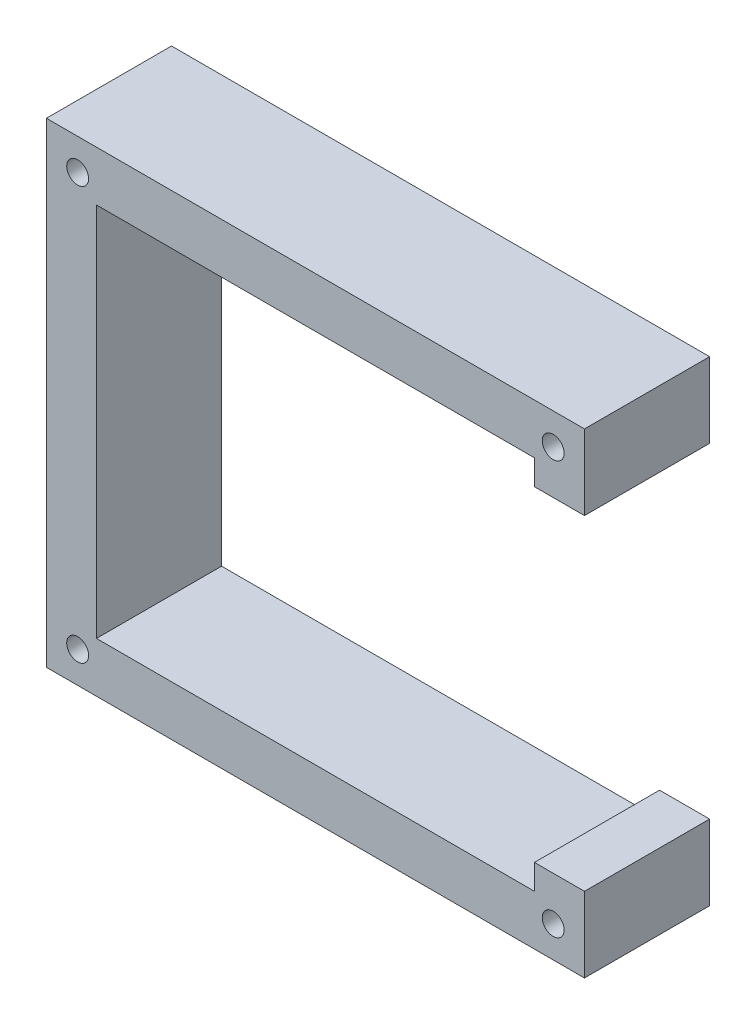
ISO-10303-21;
HEADER;
FILE_DESCRIPTION(('STEP AP214'),'2;1');
FILE_NAME('part.step','',(''),(''),'','','');
FILE_SCHEMA(('AUTOMOTIVE_DESIGN { 1 0 10303 214 1 1 1 1 }'));
ENDSEC;
DATA;
#1=APPLICATION_CONTEXT('core data for automotive mechanical design processes');
#2=APPLICATION_PROTOCOL_DEFINITION('international standard','automotive_design',2000,#1);
#3=PRODUCT_CONTEXT('',#1,'mechanical');
#4=PRODUCT('Part','Part','',(#3));
#5=PRODUCT_RELATED_PRODUCT_CATEGORY('part','',(#4));
#6=PRODUCT_DEFINITION_FORMATION('','',#4);
#7=PRODUCT_DEFINITION_CONTEXT('part definition',#1,'design');
#8=PRODUCT_DEFINITION('design','',#6,#7);
#9=PRODUCT_DEFINITION_SHAPE('','',#8);
#10=(LENGTH_UNIT() NAMED_UNIT(*) SI_UNIT(.MILLI.,.METRE.));
#11=(NAMED_UNIT(*) PLANE_ANGLE_UNIT() SI_UNIT($,.RADIAN.));
#12=(NAMED_UNIT(*) SI_UNIT($,.STERADIAN.) SOLID_ANGLE_UNIT());
#13=UNCERTAINTY_MEASURE_WITH_UNIT(LENGTH_MEASURE(1.E-05),#10,'distance_accuracy_value','');
#14=(GEOMETRIC_REPRESENTATION_CONTEXT(3) GLOBAL_UNCERTAINTY_ASSIGNED_CONTEXT((#13)) GLOBAL_UNIT_ASSIGNED_CONTEXT((#10,
#11,#12)) REPRESENTATION_CONTEXT('',''));
#15=CARTESIAN_POINT('',(0.,0.,0.));
#16=DIRECTION('',(0.,0.,1.));
#17=DIRECTION('',(1.,0.,0.));
#18=AXIS2_PLACEMENT_3D('',#15,#16,#17);
#19=CARTESIAN_POINT('',(35.,0.,20.));
#20=DIRECTION('',(1.,0.,0.));
#21=DIRECTION('',(0.,1.,0.));
#22=AXIS2_PLACEMENT_3D('',#19,#20,#21);
#23=PLANE('',#22);
#24=DIRECTION('',(0.,0.,-1.));
#25=VECTOR('',#24,1.);
#26=CARTESIAN_POINT('',(35.,-26.,20.001));
#27=LINE('',#26,#25);
#28=CARTESIAN_POINT('',(35.,-26.,20.));
#29=VERTEX_POINT('',#28);
#30=CARTESIAN_POINT('',(35.,-26.,0.));
#31=VERTEX_POINT('',#30);
#32=EDGE_CURVE('E138',#29,#31,#27,.T.);
#33=ORIENTED_EDGE('',*,*,#32,.T.);
#34=DIRECTION('',(0.,-1.,0.));
#35=VECTOR('',#34,1.);
#36=CARTESIAN_POINT('',(35.,0.,0.));
#37=LINE('',#36,#35);
#38=CARTESIAN_POINT('',(35.,-30.,0.));
#39=VERTEX_POINT('',#38);
#40=EDGE_CURVE('E193',#31,#39,#37,.T.);
#41=ORIENTED_EDGE('',*,*,#40,.T.);
#42=DIRECTION('',(0.,0.,-1.));
#43=VECTOR('',#42,1.);
#44=CARTESIAN_POINT('',(35.,-30.,20.));
#45=LINE('',#44,#43);
#46=CARTESIAN_POINT('',(35.,-30.,20.));
#47=VERTEX_POINT('',#46);
#48=EDGE_CURVE('E49',#47,#39,#45,.T.);
#49=ORIENTED_EDGE('',*,*,#48,.F.);
#50=DIRECTION('',(0.,-1.,0.));
#51=VECTOR('',#50,1.);
#52=CARTESIAN_POINT('',(35.,0.,20.));
#53=LINE('',#52,#51);
#54=EDGE_CURVE('E155',#29,#47,#53,.T.);
#55=ORIENTED_EDGE('',*,*,#54,.F.);
#56=EDGE_LOOP('',(#33,#41,#49,#55));
#57=FACE_BOUND('',#56,.T.);
#58=ADVANCED_FACE('F40',(#57),#23,.F.);
#59=DIRECTION('',(0.,0.,-1.));
#60=VECTOR('',#59,1.);
#61=CARTESIAN_POINT('',(35.,26.,20.001));
#62=LINE('',#61,#60);
#63=CARTESIAN_POINT('',(35.,26.,20.));
#64=VERTEX_POINT('',#63);
#65=CARTESIAN_POINT('',(35.,26.,0.));
#66=VERTEX_POINT('',#65);
#67=EDGE_CURVE('E57',#64,#66,#62,.T.);
#68=ORIENTED_EDGE('',*,*,#67,.F.);
#69=CARTESIAN_POINT('',(35.,30.,20.));
#70=VERTEX_POINT('',#69);
#71=EDGE_CURVE('E143',#70,#64,#53,.T.);
#72=ORIENTED_EDGE('',*,*,#71,.F.);
#73=DIRECTION('',(0.,0.,-1.));
#74=VECTOR('',#73,1.);
#75=CARTESIAN_POINT('',(35.,30.,20.));
#76=LINE('',#75,#74);
#77=CARTESIAN_POINT('',(35.,30.,0.));
#78=VERTEX_POINT('',#77);
#79=EDGE_CURVE('E11',#70,#78,#76,.T.);
#80=ORIENTED_EDGE('',*,*,#79,.T.);
#81=EDGE_CURVE('E145',#78,#66,#37,.T.);
#82=ORIENTED_EDGE('',*,*,#81,.T.);
#83=EDGE_LOOP('',(#68,#72,#80,#82));
#84=FACE_BOUND('',#83,.T.);
#85=ADVANCED_FACE('F142',(#84),#23,.F.);
#86=CARTESIAN_POINT('',(43.,0.,20.));
#87=DIRECTION('',(1.,0.,0.));
#88=DIRECTION('',(0.,1.,0.));
#89=AXIS2_PLACEMENT_3D('',#86,#87,#88);
#90=PLANE('',#89);
#91=DIRECTION('',(0.,-1.,0.));
#92=VECTOR('',#91,1.);
#93=CARTESIAN_POINT('',(43.,0.,0.));
#94=LINE('',#93,#92);
#95=CARTESIAN_POINT('',(43.,-26.,0.));
#96=VERTEX_POINT('',#95);
#97=CARTESIAN_POINT('',(43.,-38.,0.));
#98=VERTEX_POINT('',#97);
#99=EDGE_CURVE('E186',#96,#98,#94,.T.);
#100=ORIENTED_EDGE('',*,*,#99,.F.);
#101=DIRECTION('',(0.,0.,-1.));
#102=VECTOR('',#101,1.);
#103=CARTESIAN_POINT('',(43.,-26.,20.001));
#104=LINE('',#103,#102);
#105=CARTESIAN_POINT('',(43.,-26.,20.));
#106=VERTEX_POINT('',#105);
#107=EDGE_CURVE('E65',#106,#96,#104,.T.);
#108=ORIENTED_EDGE('',*,*,#107,.F.);
#109=DIRECTION('',(0.,-1.,0.));
#110=VECTOR('',#109,1.);
#111=CARTESIAN_POINT('',(43.,0.,20.));
#112=LINE('',#111,#110);
#113=CARTESIAN_POINT('',(43.,-38.,20.));
#114=VERTEX_POINT('',#113);
#115=EDGE_CURVE('E259',#106,#114,#112,.T.);
#116=ORIENTED_EDGE('',*,*,#115,.T.);
#117=DIRECTION('',(0.,0.,-1.));
#118=VECTOR('',#117,1.);
#119=CARTESIAN_POINT('',(43.,-38.,20.));
#120=LINE('',#119,#118);
#121=EDGE_CURVE('E215',#114,#98,#120,.T.);
#122=ORIENTED_EDGE('',*,*,#121,.T.);
#123=EDGE_LOOP('',(#100,#108,#116,#122));
#124=FACE_BOUND('',#123,.T.);
#125=ADVANCED_FACE('F262',(#124),#90,.T.);
#126=CARTESIAN_POINT('',(43.,38.,20.));
#127=VERTEX_POINT('',#126);
#128=CARTESIAN_POINT('',(43.,26.,20.));
#129=VERTEX_POINT('',#128);
#130=EDGE_CURVE('E238',#127,#129,#112,.T.);
#131=ORIENTED_EDGE('',*,*,#130,.T.);
#132=DIRECTION('',(0.,0.,-1.));
#133=VECTOR('',#132,1.);
#134=CARTESIAN_POINT('',(43.,26.,20.001));
#135=LINE('',#134,#133);
#136=CARTESIAN_POINT('',(43.,26.,0.));
#137=VERTEX_POINT('',#136);
#138=EDGE_CURVE('E132',#129,#137,#135,.T.);
#139=ORIENTED_EDGE('',*,*,#138,.T.);
#140=CARTESIAN_POINT('',(43.,38.,0.));
#141=VERTEX_POINT('',#140);
#142=EDGE_CURVE('E187',#141,#137,#94,.T.);
#143=ORIENTED_EDGE('',*,*,#142,.F.);
#144=DIRECTION('',(0.,0.,-1.));
#145=VECTOR('',#144,1.);
#146=CARTESIAN_POINT('',(43.,38.,20.));
#147=LINE('',#146,#145);
#148=EDGE_CURVE('E171',#127,#141,#147,.T.);
#149=ORIENTED_EDGE('',*,*,#148,.F.);
#150=EDGE_LOOP('',(#131,#139,#143,#149));
#151=FACE_BOUND('',#150,.T.);
#152=ADVANCED_FACE('F237',(#151),#90,.T.);
#153=CARTESIAN_POINT('',(0.,0.,20.));
#154=DIRECTION('',(0.,0.,1.));
#155=DIRECTION('',(1.,0.,0.));
#156=AXIS2_PLACEMENT_3D('',#153,#154,#155);
#157=PLANE('',#156);
#158=CARTESIAN_POINT('',(38.,33.,20.));
#159=DIRECTION('',(0.,0.,1.));
#160=DIRECTION('',(1.,0.,0.));
#161=AXIS2_PLACEMENT_3D('',#158,#159,#160);
#162=CIRCLE('',#161,1.75);
#163=CARTESIAN_POINT('',(39.75,33.,20.));
#164=VERTEX_POINT('',#163);
#165=EDGE_CURVE('E207',#164,#164,#162,.F.);
#166=ORIENTED_EDGE('',*,*,#165,.T.);
#167=EDGE_LOOP('',(#166));
#168=FACE_BOUND('',#167,.T.);
#169=CARTESIAN_POINT('',(-38.,33.,20.));
#170=DIRECTION('',(0.,0.,1.));
#171=DIRECTION('',(1.,0.,0.));
#172=AXIS2_PLACEMENT_3D('',#169,#170,#171);
#173=CIRCLE('',#172,1.75);
#174=CARTESIAN_POINT('',(-36.25,33.,20.));
#175=VERTEX_POINT('',#174);
#176=EDGE_CURVE('E252',#175,#175,#173,.T.);
#177=ORIENTED_EDGE('',*,*,#176,.F.);
#178=EDGE_LOOP('',(#177));
#179=FACE_BOUND('',#178,.T.);
#180=CARTESIAN_POINT('',(38.,-33.,20.));
#181=DIRECTION('',(0.,0.,1.));
#182=DIRECTION('',(1.,0.,0.));
#183=AXIS2_PLACEMENT_3D('',#180,#181,#182);
#184=CIRCLE('',#183,1.75);
#185=CARTESIAN_POINT('',(39.75,-33.,20.));
#186=VERTEX_POINT('',#185);
#187=EDGE_CURVE('E165',#186,#186,#184,.T.);
#188=ORIENTED_EDGE('',*,*,#187,.F.);
#189=EDGE_LOOP('',(#188));
#190=FACE_BOUND('',#189,.T.);
#191=CARTESIAN_POINT('',(-38.,-33.,20.));
#192=DIRECTION('',(0.,0.,1.));
#193=DIRECTION('',(1.,0.,0.));
#194=AXIS2_PLACEMENT_3D('',#191,#192,#193);
#195=CIRCLE('',#194,1.75);
#196=CARTESIAN_POINT('',(-36.25,-33.,20.));
#197=VERTEX_POINT('',#196);
#198=EDGE_CURVE('E168',#197,#197,#195,.F.);
#199=ORIENTED_EDGE('',*,*,#198,.T.);
#200=EDGE_LOOP('',(#199));
#201=FACE_BOUND('',#200,.T.);
#202=ORIENTED_EDGE('',*,*,#115,.F.);
#203=DIRECTION('',(1.,0.,0.));
#204=VECTOR('',#203,1.);
#205=CARTESIAN_POINT('',(0.,-26.,20.));
#206=LINE('',#205,#204);
#207=EDGE_CURVE('E241',#29,#106,#206,.T.);
#208=ORIENTED_EDGE('',*,*,#207,.F.);
#209=ORIENTED_EDGE('',*,*,#54,.T.);
#210=DIRECTION('',(1.,0.,0.));
#211=VECTOR('',#210,1.);
#212=CARTESIAN_POINT('',(0.,-30.,20.));
#213=LINE('',#212,#211);
#214=CARTESIAN_POINT('',(-35.,-30.,20.));
#215=VERTEX_POINT('',#214);
#216=EDGE_CURVE('E154',#215,#47,#213,.T.);
#217=ORIENTED_EDGE('',*,*,#216,.F.);
#218=DIRECTION('',(0.,-1.,0.));
#219=VECTOR('',#218,1.);
#220=CARTESIAN_POINT('',(-35.,0.,20.));
#221=LINE('',#220,#219);
#222=CARTESIAN_POINT('',(-35.,30.,20.));
#223=VERTEX_POINT('',#222);
#224=EDGE_CURVE('E158',#223,#215,#221,.T.);
#225=ORIENTED_EDGE('',*,*,#224,.F.);
#226=DIRECTION('',(1.,0.,0.));
#227=VECTOR('',#226,1.);
#228=CARTESIAN_POINT('',(0.,30.,20.));
#229=LINE('',#228,#227);
#230=EDGE_CURVE('E152',#223,#70,#229,.T.);
#231=ORIENTED_EDGE('',*,*,#230,.T.);
#232=ORIENTED_EDGE('',*,*,#71,.T.);
#233=DIRECTION('',(-1.,0.,0.));
#234=VECTOR('',#233,1.);
#235=CARTESIAN_POINT('',(0.,26.,20.));
#236=LINE('',#235,#234);
#237=EDGE_CURVE('E129',#129,#64,#236,.T.);
#238=ORIENTED_EDGE('',*,*,#237,.F.);
#239=ORIENTED_EDGE('',*,*,#130,.F.);
#240=DIRECTION('',(1.,0.,0.));
#241=VECTOR('',#240,1.);
#242=CARTESIAN_POINT('',(0.,38.,20.));
#243=LINE('',#242,#241);
#244=CARTESIAN_POINT('',(-43.,38.,20.));
#245=VERTEX_POINT('',#244);
#246=EDGE_CURVE('E235',#245,#127,#243,.T.);
#247=ORIENTED_EDGE('',*,*,#246,.F.);
#248=DIRECTION('',(0.,-1.,0.));
#249=VECTOR('',#248,1.);
#250=CARTESIAN_POINT('',(-43.,0.,20.));
#251=LINE('',#250,#249);
#252=CARTESIAN_POINT('',(-43.,-38.,20.));
#253=VERTEX_POINT('',#252);
#254=EDGE_CURVE('E226',#245,#253,#251,.T.);
#255=ORIENTED_EDGE('',*,*,#254,.T.);
#256=DIRECTION('',(1.,0.,0.));
#257=VECTOR('',#256,1.);
#258=CARTESIAN_POINT('',(0.,-38.,20.));
#259=LINE('',#258,#257);
#260=EDGE_CURVE('E257',#253,#114,#259,.T.);
#261=ORIENTED_EDGE('',*,*,#260,.T.);
#262=EDGE_LOOP('',(#202,#208,#209,#217,#225,#231,#232,#238,#239,#247,#255,#261));
#263=FACE_BOUND('',#262,.T.);
#264=ADVANCED_FACE('F149',(#168,#179,#190,#201,#263),#157,.T.);
#265=CARTESIAN_POINT('',(0.,0.,0.));
#266=DIRECTION('',(0.,0.,1.));
#267=DIRECTION('',(1.,0.,0.));
#268=AXIS2_PLACEMENT_3D('',#265,#266,#267);
#269=PLANE('',#268);
#270=CARTESIAN_POINT('',(-38.,-33.,0.));
#271=DIRECTION('',(0.,0.,1.));
#272=DIRECTION('',(1.,0.,0.));
#273=AXIS2_PLACEMENT_3D('',#270,#271,#272);
#274=CIRCLE('',#273,1.75);
#275=CARTESIAN_POINT('',(-36.25,-33.,0.));
#276=VERTEX_POINT('',#275);
#277=EDGE_CURVE('E204',#276,#276,#274,.F.);
#278=ORIENTED_EDGE('',*,*,#277,.F.);
#279=EDGE_LOOP('',(#278));
#280=FACE_BOUND('',#279,.T.);
#281=CARTESIAN_POINT('',(38.,-33.,0.));
#282=DIRECTION('',(0.,0.,1.));
#283=DIRECTION('',(1.,0.,0.));
#284=AXIS2_PLACEMENT_3D('',#281,#282,#283);
#285=CIRCLE('',#284,1.75);
#286=CARTESIAN_POINT('',(39.75,-33.,0.));
#287=VERTEX_POINT('',#286);
#288=EDGE_CURVE('E201',#287,#287,#285,.T.);
#289=ORIENTED_EDGE('',*,*,#288,.T.);
#290=EDGE_LOOP('',(#289));
#291=FACE_BOUND('',#290,.T.);
#292=CARTESIAN_POINT('',(-38.,33.,0.));
#293=DIRECTION('',(0.,0.,1.));
#294=DIRECTION('',(1.,0.,0.));
#295=AXIS2_PLACEMENT_3D('',#292,#293,#294);
#296=CIRCLE('',#295,1.75);
#297=CARTESIAN_POINT('',(-36.25,33.,0.));
#298=VERTEX_POINT('',#297);
#299=EDGE_CURVE('E174',#298,#298,#296,.T.);
#300=ORIENTED_EDGE('',*,*,#299,.T.);
#301=EDGE_LOOP('',(#300));
#302=FACE_BOUND('',#301,.T.);
#303=CARTESIAN_POINT('',(38.,33.,0.));
#304=DIRECTION('',(0.,0.,1.));
#305=DIRECTION('',(1.,0.,0.));
#306=AXIS2_PLACEMENT_3D('',#303,#304,#305);
#307=CIRCLE('',#306,1.75);
#308=CARTESIAN_POINT('',(39.75,33.,0.));
#309=VERTEX_POINT('',#308);
#310=EDGE_CURVE('E137',#309,#309,#307,.F.);
#311=ORIENTED_EDGE('',*,*,#310,.F.);
#312=EDGE_LOOP('',(#311));
#313=FACE_BOUND('',#312,.T.);
#314=DIRECTION('',(1.,0.,0.));
#315=VECTOR('',#314,1.);
#316=CARTESIAN_POINT('',(0.,-26.,0.));
#317=LINE('',#316,#315);
#318=EDGE_CURVE('E146',#31,#96,#317,.T.);
#319=ORIENTED_EDGE('',*,*,#318,.T.);
#320=ORIENTED_EDGE('',*,*,#99,.T.);
#321=DIRECTION('',(1.,0.,0.));
#322=VECTOR('',#321,1.);
#323=CARTESIAN_POINT('',(0.,-38.,0.));
#324=LINE('',#323,#322);
#325=CARTESIAN_POINT('',(-43.,-38.,0.));
#326=VERTEX_POINT('',#325);
#327=EDGE_CURVE('E183',#326,#98,#324,.T.);
#328=ORIENTED_EDGE('',*,*,#327,.F.);
#329=DIRECTION('',(0.,-1.,0.));
#330=VECTOR('',#329,1.);
#331=CARTESIAN_POINT('',(-43.,0.,0.));
#332=LINE('',#331,#330);
#333=CARTESIAN_POINT('',(-43.,38.,0.));
#334=VERTEX_POINT('',#333);
#335=EDGE_CURVE('E180',#334,#326,#332,.T.);
#336=ORIENTED_EDGE('',*,*,#335,.F.);
#337=DIRECTION('',(1.,0.,0.));
#338=VECTOR('',#337,1.);
#339=CARTESIAN_POINT('',(0.,38.,0.));
#340=LINE('',#339,#338);
#341=EDGE_CURVE('E177',#334,#141,#340,.T.);
#342=ORIENTED_EDGE('',*,*,#341,.T.);
#343=ORIENTED_EDGE('',*,*,#142,.T.);
#344=DIRECTION('',(-1.,0.,0.));
#345=VECTOR('',#344,1.);
#346=CARTESIAN_POINT('',(0.,26.,0.));
#347=LINE('',#346,#345);
#348=EDGE_CURVE('E239',#137,#66,#347,.T.);
#349=ORIENTED_EDGE('',*,*,#348,.T.);
#350=ORIENTED_EDGE('',*,*,#81,.F.);
#351=DIRECTION('',(1.,0.,0.));
#352=VECTOR('',#351,1.);
#353=CARTESIAN_POINT('',(0.,30.,0.));
#354=LINE('',#353,#352);
#355=CARTESIAN_POINT('',(-35.,30.,0.));
#356=VERTEX_POINT('',#355);
#357=EDGE_CURVE('E190',#356,#78,#354,.T.);
#358=ORIENTED_EDGE('',*,*,#357,.F.);
#359=DIRECTION('',(0.,-1.,0.));
#360=VECTOR('',#359,1.);
#361=CARTESIAN_POINT('',(-35.,0.,0.));
#362=LINE('',#361,#360);
#363=CARTESIAN_POINT('',(-35.,-30.,0.));
#364=VERTEX_POINT('',#363);
#365=EDGE_CURVE('E198',#356,#364,#362,.T.);
#366=ORIENTED_EDGE('',*,*,#365,.T.);
#367=DIRECTION('',(1.,0.,0.));
#368=VECTOR('',#367,1.);
#369=CARTESIAN_POINT('',(0.,-30.,0.));
#370=LINE('',#369,#368);
#371=EDGE_CURVE('E195',#364,#39,#370,.T.);
#372=ORIENTED_EDGE('',*,*,#371,.T.);
#373=ORIENTED_EDGE('',*,*,#40,.F.);
#374=EDGE_LOOP('',(#319,#320,#328,#336,#342,#343,#349,#350,#358,#366,#372,#373));
#375=FACE_BOUND('',#374,.T.);
#376=ADVANCED_FACE('F232',(#280,#291,#302,#313,#375),#269,.F.);
#377=CARTESIAN_POINT('',(0.,30.,20.));
#378=DIRECTION('',(0.,1.,0.));
#379=DIRECTION('',(0.,0.,1.));
#380=AXIS2_PLACEMENT_3D('',#377,#378,#379);
#381=PLANE('',#380);
#382=ORIENTED_EDGE('',*,*,#357,.T.);
#383=ORIENTED_EDGE('',*,*,#79,.F.);
#384=ORIENTED_EDGE('',*,*,#230,.F.);
#385=DIRECTION('',(0.,0.,-1.));
#386=VECTOR('',#385,1.);
#387=CARTESIAN_POINT('',(-35.,30.,20.));
#388=LINE('',#387,#386);
#389=EDGE_CURVE('E208',#223,#356,#388,.T.);
#390=ORIENTED_EDGE('',*,*,#389,.T.);
#391=EDGE_LOOP('',(#382,#383,#384,#390));
#392=FACE_BOUND('',#391,.T.);
#393=ADVANCED_FACE('F288',(#392),#381,.F.);
#394=CARTESIAN_POINT('',(0.,-30.,20.));
#395=DIRECTION('',(0.,1.,0.));
#396=DIRECTION('',(0.,0.,1.));
#397=AXIS2_PLACEMENT_3D('',#394,#395,#396);
#398=PLANE('',#397);
#399=ORIENTED_EDGE('',*,*,#371,.F.);
#400=DIRECTION('',(0.,0.,-1.));
#401=VECTOR('',#400,1.);
#402=CARTESIAN_POINT('',(-35.,-30.,20.));
#403=LINE('',#402,#401);
#404=EDGE_CURVE('E210',#215,#364,#403,.T.);
#405=ORIENTED_EDGE('',*,*,#404,.F.);
#406=ORIENTED_EDGE('',*,*,#216,.T.);
#407=ORIENTED_EDGE('',*,*,#48,.T.);
#408=EDGE_LOOP('',(#399,#405,#406,#407));
#409=FACE_BOUND('',#408,.T.);
#410=ADVANCED_FACE('F286',(#409),#398,.T.);
#411=CARTESIAN_POINT('',(0.,38.,20.));
#412=DIRECTION('',(0.,1.,0.));
#413=DIRECTION('',(0.,0.,1.));
#414=AXIS2_PLACEMENT_3D('',#411,#412,#413);
#415=PLANE('',#414);
#416=ORIENTED_EDGE('',*,*,#341,.F.);
#417=DIRECTION('',(0.,0.,-1.));
#418=VECTOR('',#417,1.);
#419=CARTESIAN_POINT('',(-43.,38.,20.));
#420=LINE('',#419,#418);
#421=EDGE_CURVE('E44',#245,#334,#420,.T.);
#422=ORIENTED_EDGE('',*,*,#421,.F.);
#423=ORIENTED_EDGE('',*,*,#246,.T.);
#424=ORIENTED_EDGE('',*,*,#148,.T.);
#425=EDGE_LOOP('',(#416,#422,#423,#424));
#426=FACE_BOUND('',#425,.T.);
#427=ADVANCED_FACE('F234',(#426),#415,.T.);
#428=CARTESIAN_POINT('',(-43.,0.,20.));
#429=DIRECTION('',(1.,0.,0.));
#430=DIRECTION('',(0.,0.,-1.));
#431=AXIS2_PLACEMENT_3D('',#428,#429,#430);
#432=PLANE('',#431);
#433=ORIENTED_EDGE('',*,*,#335,.T.);
#434=DIRECTION('',(0.,0.,-1.));
#435=VECTOR('',#434,1.);
#436=CARTESIAN_POINT('',(-43.,-38.,20.));
#437=LINE('',#436,#435);
#438=EDGE_CURVE('E217',#253,#326,#437,.T.);
#439=ORIENTED_EDGE('',*,*,#438,.F.);
#440=ORIENTED_EDGE('',*,*,#254,.F.);
#441=ORIENTED_EDGE('',*,*,#421,.T.);
#442=EDGE_LOOP('',(#433,#439,#440,#441));
#443=FACE_BOUND('',#442,.T.);
#444=ADVANCED_FACE('F224',(#443),#432,.F.);
#445=CARTESIAN_POINT('',(0.,-38.,20.));
#446=DIRECTION('',(0.,1.,0.));
#447=DIRECTION('',(-1.,0.,0.));
#448=AXIS2_PLACEMENT_3D('',#445,#446,#447);
#449=PLANE('',#448);
#450=ORIENTED_EDGE('',*,*,#327,.T.);
#451=ORIENTED_EDGE('',*,*,#121,.F.);
#452=ORIENTED_EDGE('',*,*,#260,.F.);
#453=ORIENTED_EDGE('',*,*,#438,.T.);
#454=EDGE_LOOP('',(#450,#451,#452,#453));
#455=FACE_BOUND('',#454,.T.);
#456=ADVANCED_FACE('F265',(#455),#449,.F.);
#457=CARTESIAN_POINT('',(38.,-33.,20.));
#458=DIRECTION('',(0.,0.,-1.));
#459=DIRECTION('',(-1.,0.,0.));
#460=AXIS2_PLACEMENT_3D('',#457,#458,#459);
#461=CYLINDRICAL_SURFACE('',#460,1.75);
#462=ORIENTED_EDGE('',*,*,#187,.T.);
#463=EDGE_LOOP('',(#462));
#464=FACE_BOUND('',#463,.T.);
#465=ORIENTED_EDGE('',*,*,#288,.F.);
#466=EDGE_LOOP('',(#465));
#467=FACE_BOUND('',#466,.T.);
#468=ADVANCED_FACE('F267',(#464,#467),#461,.F.);
#469=CARTESIAN_POINT('',(-35.,0.,20.));
#470=DIRECTION('',(1.,0.,0.));
#471=DIRECTION('',(0.,1.,0.));
#472=AXIS2_PLACEMENT_3D('',#469,#470,#471);
#473=PLANE('',#472);
#474=ORIENTED_EDGE('',*,*,#365,.F.);
#475=ORIENTED_EDGE('',*,*,#389,.F.);
#476=ORIENTED_EDGE('',*,*,#224,.T.);
#477=ORIENTED_EDGE('',*,*,#404,.T.);
#478=EDGE_LOOP('',(#474,#475,#476,#477));
#479=FACE_BOUND('',#478,.T.);
#480=ADVANCED_FACE('F273',(#479),#473,.T.);
#481=CARTESIAN_POINT('',(-38.,33.,20.));
#482=DIRECTION('',(0.,0.,-1.));
#483=DIRECTION('',(-1.,0.,0.));
#484=AXIS2_PLACEMENT_3D('',#481,#482,#483);
#485=CYLINDRICAL_SURFACE('',#484,1.75);
#486=ORIENTED_EDGE('',*,*,#176,.T.);
#487=EDGE_LOOP('',(#486));
#488=FACE_BOUND('',#487,.T.);
#489=ORIENTED_EDGE('',*,*,#299,.F.);
#490=EDGE_LOOP('',(#489));
#491=FACE_BOUND('',#490,.T.);
#492=ADVANCED_FACE('F313',(#488,#491),#485,.F.);
#493=CARTESIAN_POINT('',(38.,33.,20.));
#494=DIRECTION('',(0.,0.,-1.));
#495=DIRECTION('',(-1.,0.,0.));
#496=AXIS2_PLACEMENT_3D('',#493,#494,#495);
#497=CYLINDRICAL_SURFACE('',#496,1.75);
#498=ORIENTED_EDGE('',*,*,#165,.F.);
#499=EDGE_LOOP('',(#498));
#500=FACE_BOUND('',#499,.T.);
#501=ORIENTED_EDGE('',*,*,#310,.T.);
#502=EDGE_LOOP('',(#501));
#503=FACE_BOUND('',#502,.T.);
#504=ADVANCED_FACE('F42',(#500,#503),#497,.F.);
#505=CARTESIAN_POINT('',(-38.,-33.,20.));
#506=DIRECTION('',(0.,0.,-1.));
#507=DIRECTION('',(-1.,0.,0.));
#508=AXIS2_PLACEMENT_3D('',#505,#506,#507);
#509=CYLINDRICAL_SURFACE('',#508,1.75);
#510=ORIENTED_EDGE('',*,*,#198,.F.);
#511=EDGE_LOOP('',(#510));
#512=FACE_BOUND('',#511,.T.);
#513=ORIENTED_EDGE('',*,*,#277,.T.);
#514=EDGE_LOOP('',(#513));
#515=FACE_BOUND('',#514,.T.);
#516=ADVANCED_FACE('F309',(#512,#515),#509,.F.);
#517=CARTESIAN_POINT('',(0.,26.,20.001));
#518=DIRECTION('',(0.,-1.,0.));
#519=DIRECTION('',(0.,0.,-1.));
#520=AXIS2_PLACEMENT_3D('',#517,#518,#519);
#521=PLANE('',#520);
#522=ORIENTED_EDGE('',*,*,#237,.T.);
#523=ORIENTED_EDGE('',*,*,#67,.T.);
#524=ORIENTED_EDGE('',*,*,#348,.F.);
#525=ORIENTED_EDGE('',*,*,#138,.F.);
#526=EDGE_LOOP('',(#522,#523,#524,#525));
#527=FACE_BOUND('',#526,.T.);
#528=ADVANCED_FACE('F130',(#527),#521,.T.);
#529=CARTESIAN_POINT('',(0.,-26.,20.001));
#530=DIRECTION('',(0.,1.,0.));
#531=DIRECTION('',(-1.,0.,0.));
#532=AXIS2_PLACEMENT_3D('',#529,#530,#531);
#533=PLANE('',#532);
#534=ORIENTED_EDGE('',*,*,#207,.T.);
#535=ORIENTED_EDGE('',*,*,#107,.T.);
#536=ORIENTED_EDGE('',*,*,#318,.F.);
#537=ORIENTED_EDGE('',*,*,#32,.F.);
#538=EDGE_LOOP('',(#534,#535,#536,#537));
#539=FACE_BOUND('',#538,.T.);
#540=ADVANCED_FACE('F326',(#539),#533,.T.);
#541=CLOSED_SHELL('',(#58,#85,#125,#152,#264,#376,#393,#410,#427,#444,#456,#468,#480,#492,#504,
#516,#528,#540));
#542=MANIFOLD_SOLID_BREP('B2',#541);
#543=ADVANCED_BREP_SHAPE_REPRESENTATION('',(#18,#542),#14);
#544=SHAPE_DEFINITION_REPRESENTATION(#9,#543);
ENDSEC;
END-ISO-10303-21;
